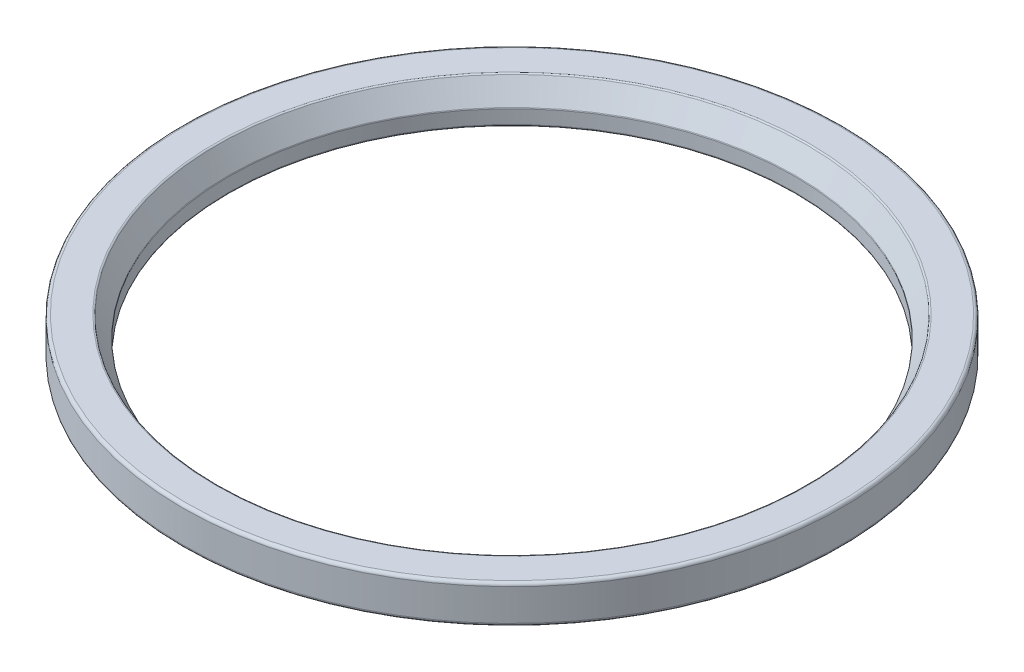
ISO-10303-21;
HEADER;
FILE_DESCRIPTION(('STEP AP214'),'2;1');
FILE_NAME('part.step','',(''),(''),'','','');
FILE_SCHEMA(('AUTOMOTIVE_DESIGN { 1 0 10303 214 1 1 1 1 }'));
ENDSEC;
DATA;
#1=APPLICATION_CONTEXT('core data for automotive mechanical design processes');
#2=APPLICATION_PROTOCOL_DEFINITION('international standard','automotive_design',2000,#1);
#3=PRODUCT_CONTEXT('',#1,'mechanical');
#4=PRODUCT('Part','Part','',(#3));
#5=PRODUCT_RELATED_PRODUCT_CATEGORY('part','',(#4));
#6=PRODUCT_DEFINITION_FORMATION('','',#4);
#7=PRODUCT_DEFINITION_CONTEXT('part definition',#1,'design');
#8=PRODUCT_DEFINITION('design','',#6,#7);
#9=PRODUCT_DEFINITION_SHAPE('','',#8);
#10=(LENGTH_UNIT() NAMED_UNIT(*) SI_UNIT(.MILLI.,.METRE.));
#11=(NAMED_UNIT(*) PLANE_ANGLE_UNIT() SI_UNIT($,.RADIAN.));
#12=(NAMED_UNIT(*) SI_UNIT($,.STERADIAN.) SOLID_ANGLE_UNIT());
#13=UNCERTAINTY_MEASURE_WITH_UNIT(LENGTH_MEASURE(1.E-05),#10,'distance_accuracy_value','');
#14=(GEOMETRIC_REPRESENTATION_CONTEXT(3) GLOBAL_UNCERTAINTY_ASSIGNED_CONTEXT((#13)) GLOBAL_UNIT_ASSIGNED_CONTEXT((#10,
#11,#12)) REPRESENTATION_CONTEXT('',''));
#15=CARTESIAN_POINT('',(0.,0.,0.));
#16=DIRECTION('',(0.,0.,1.));
#17=DIRECTION('',(1.,0.,0.));
#18=AXIS2_PLACEMENT_3D('',#15,#16,#17);
#19=CARTESIAN_POINT('',(0.,20.827256095235,0.));
#20=DIRECTION('',(0.,-1.,0.));
#21=DIRECTION('',(0.,0.,-1.));
#22=AXIS2_PLACEMENT_3D('',#19,#20,#21);
#23=TOROIDAL_SURFACE('',#22,49.25,14.4626191509308);
#24=CARTESIAN_POINT('',(0.,6.80030838335541,0.));
#25=DIRECTION('',(0.,1.,0.));
#26=DIRECTION('',(0.,0.,1.));
#27=AXIS2_PLACEMENT_3D('',#24,#25,#26);
#28=CIRCLE('',#27,45.7269202970884);
#29=CARTESIAN_POINT('',(0.,6.80030838335541,45.7269202970884));
#30=VERTEX_POINT('',#29);
#31=EDGE_CURVE('E46',#30,#30,#28,.T.);
#32=ORIENTED_EDGE('',*,*,#31,.T.);
#33=EDGE_LOOP('',(#32));
#34=FACE_BOUND('',#33,.T.);
#35=CARTESIAN_POINT('',(0.,6.76187932282945,0.));
#36=DIRECTION('',(0.,1.,0.));
#37=DIRECTION('',(0.,0.,1.));
#38=AXIS2_PLACEMENT_3D('',#35,#36,#37);
#39=CIRCLE('',#38,52.6163821760399);
#40=CARTESIAN_POINT('',(0.,6.76187932282945,52.6163821760399));
#41=VERTEX_POINT('',#40);
#42=EDGE_CURVE('E66',#41,#41,#39,.F.);
#43=ORIENTED_EDGE('',*,*,#42,.T.);
#44=EDGE_LOOP('',(#43));
#45=FACE_BOUND('',#44,.T.);
#46=ADVANCED_FACE('F31',(#34,#45),#23,.T.);
#47=CARTESIAN_POINT('',(0.,-41.5419884809563,0.));
#48=DIRECTION('',(0.,-1.,0.));
#49=DIRECTION('',(0.,0.,-1.));
#50=AXIS2_PLACEMENT_3D('',#47,#48,#49);
#51=CYLINDRICAL_SURFACE('',#50,53.);
#52=CARTESIAN_POINT('',(0.,7.2481459051695,0.));
#53=DIRECTION('',(0.,1.,0.));
#54=DIRECTION('',(0.,0.,1.));
#55=AXIS2_PLACEMENT_3D('',#52,#53,#54);
#56=CIRCLE('',#55,53.);
#57=CARTESIAN_POINT('',(0.,7.2481459051695,53.));
#58=VERTEX_POINT('',#57);
#59=EDGE_CURVE('E60',#58,#58,#56,.T.);
#60=ORIENTED_EDGE('',*,*,#59,.T.);
#61=EDGE_LOOP('',(#60));
#62=FACE_BOUND('',#61,.T.);
#63=CARTESIAN_POINT('',(0.,12.3592622269348,0.));
#64=DIRECTION('',(0.,1.,0.));
#65=DIRECTION('',(0.,0.,1.));
#66=AXIS2_PLACEMENT_3D('',#63,#64,#65);
#67=CIRCLE('',#66,53.);
#68=CARTESIAN_POINT('',(0.,12.3592622269348,53.));
#69=VERTEX_POINT('',#68);
#70=EDGE_CURVE('E63',#69,#69,#67,.F.);
#71=ORIENTED_EDGE('',*,*,#70,.T.);
#72=EDGE_LOOP('',(#71));
#73=FACE_BOUND('',#72,.T.);
#74=ADVANCED_FACE('F90',(#62,#73),#51,.T.);
#75=CARTESIAN_POINT('',(47.5,12.8592622269348,0.));
#76=DIRECTION('',(0.,1.,0.));
#77=DIRECTION('',(0.,0.,1.));
#78=AXIS2_PLACEMENT_3D('',#75,#76,#77);
#79=PLANE('',#78);
#80=CARTESIAN_POINT('',(0.,12.8592622269348,0.));
#81=DIRECTION('',(0.,1.,0.));
#82=DIRECTION('',(0.,0.,1.));
#83=AXIS2_PLACEMENT_3D('',#80,#81,#82);
#84=CIRCLE('',#83,47.6740967606414);
#85=CARTESIAN_POINT('',(0.,12.8592622269348,47.6740967606414));
#86=VERTEX_POINT('',#85);
#87=EDGE_CURVE('E10',#86,#86,#84,.F.);
#88=ORIENTED_EDGE('',*,*,#87,.T.);
#89=EDGE_LOOP('',(#88));
#90=FACE_BOUND('',#89,.T.);
#91=CARTESIAN_POINT('',(0.,12.8592622269348,0.));
#92=DIRECTION('',(0.,1.,0.));
#93=DIRECTION('',(0.,0.,1.));
#94=AXIS2_PLACEMENT_3D('',#91,#92,#93);
#95=CIRCLE('',#94,52.5);
#96=CARTESIAN_POINT('',(0.,12.8592622269348,52.5));
#97=VERTEX_POINT('',#96);
#98=EDGE_CURVE('E57',#97,#97,#95,.T.);
#99=ORIENTED_EDGE('',*,*,#98,.T.);
#100=EDGE_LOOP('',(#99));
#101=FACE_BOUND('',#100,.T.);
#102=ADVANCED_FACE('F95',(#90,#101),#79,.T.);
#103=CARTESIAN_POINT('',(0.,12.8592622269348,0.));
#104=DIRECTION('',(0.,1.,0.));
#105=DIRECTION('',(0.,0.,1.));
#106=AXIS2_PLACEMENT_3D('',#103,#104,#105);
#107=CONICAL_SURFACE('',#106,47.5,0.519146114246522);
#108=CARTESIAN_POINT('',(0.,9.42843457731948,0.));
#109=DIRECTION('',(0.,-1.,0.));
#110=DIRECTION('',(0.,0.,-1.));
#111=AXIS2_PLACEMENT_3D('',#108,#109,#110);
#112=CIRCLE('',#111,45.5395270573627);
#113=CARTESIAN_POINT('',(0.,9.42843457731948,-45.5395270573627));
#114=VERTEX_POINT('',#113);
#115=EDGE_CURVE('E38',#114,#114,#112,.T.);
#116=ORIENTED_EDGE('',*,*,#115,.T.);
#117=EDGE_LOOP('',(#116));
#118=FACE_BOUND('',#117,.T.);
#119=CARTESIAN_POINT('',(0.,12.7081039084419,0.));
#120=DIRECTION('',(0.,-1.,0.));
#121=DIRECTION('',(0.,0.,-1.));
#122=AXIS2_PLACEMENT_3D('',#119,#120,#121);
#123=CIRCLE('',#122,47.413623818004);
#124=CARTESIAN_POINT('',(0.,12.7081039084419,-47.413623818004));
#125=VERTEX_POINT('',#124);
#126=EDGE_CURVE('E42',#125,#125,#123,.F.);
#127=ORIENTED_EDGE('',*,*,#126,.T.);
#128=EDGE_LOOP('',(#127));
#129=FACE_BOUND('',#128,.T.);
#130=ADVANCED_FACE('F84',(#118,#129),#107,.F.);
#131=CARTESIAN_POINT('',(0.,-41.5419884809563,0.));
#132=DIRECTION('',(0.,-1.,0.));
#133=DIRECTION('',(0.,0.,-1.));
#134=AXIS2_PLACEMENT_3D('',#131,#132,#133);
#135=CYLINDRICAL_SURFACE('',#134,45.5);
#136=CARTESIAN_POINT('',(0.,7.09127119373219,0.));
#137=DIRECTION('',(0.,1.,0.));
#138=DIRECTION('',(0.,0.,1.));
#139=AXIS2_PLACEMENT_3D('',#136,#137,#138);
#140=CIRCLE('',#139,45.5);
#141=CARTESIAN_POINT('',(0.,7.09127119373219,45.5));
#142=VERTEX_POINT('',#141);
#143=EDGE_CURVE('E51',#142,#142,#140,.F.);
#144=ORIENTED_EDGE('',*,*,#143,.T.);
#145=EDGE_LOOP('',(#144));
#146=FACE_BOUND('',#145,.T.);
#147=CARTESIAN_POINT('',(0.,9.27959289581241,0.));
#148=DIRECTION('',(0.,1.,0.));
#149=DIRECTION('',(0.,0.,1.));
#150=AXIS2_PLACEMENT_3D('',#147,#148,#149);
#151=CIRCLE('',#150,45.5);
#152=CARTESIAN_POINT('',(0.,9.27959289581241,45.5));
#153=VERTEX_POINT('',#152);
#154=EDGE_CURVE('E54',#153,#153,#151,.T.);
#155=ORIENTED_EDGE('',*,*,#154,.T.);
#156=EDGE_LOOP('',(#155));
#157=FACE_BOUND('',#156,.T.);
#158=ADVANCED_FACE('F74',(#146,#157),#135,.F.);
#159=CARTESIAN_POINT('',(0.,7.2481459051695,0.));
#160=DIRECTION('',(0.,1.,0.));
#161=DIRECTION('',(0.,0.,1.));
#162=AXIS2_PLACEMENT_3D('',#159,#160,#161);
#163=TOROIDAL_SURFACE('',#162,52.5,0.5);
#164=ORIENTED_EDGE('',*,*,#59,.F.);
#165=EDGE_LOOP('',(#164));
#166=FACE_BOUND('',#165,.T.);
#167=ORIENTED_EDGE('',*,*,#42,.F.);
#168=EDGE_LOOP('',(#167));
#169=FACE_BOUND('',#168,.T.);
#170=ADVANCED_FACE('F71',(#166,#169),#163,.T.);
#171=CARTESIAN_POINT('',(0.,12.3592622269348,0.));
#172=DIRECTION('',(0.,1.,0.));
#173=DIRECTION('',(0.,0.,1.));
#174=AXIS2_PLACEMENT_3D('',#171,#172,#173);
#175=TOROIDAL_SURFACE('',#174,52.5,0.5);
#176=ORIENTED_EDGE('',*,*,#98,.F.);
#177=EDGE_LOOP('',(#176));
#178=FACE_BOUND('',#177,.T.);
#179=ORIENTED_EDGE('',*,*,#70,.F.);
#180=EDGE_LOOP('',(#179));
#181=FACE_BOUND('',#180,.T.);
#182=ADVANCED_FACE('F73',(#178,#181),#175,.T.);
#183=CARTESIAN_POINT('',(0.,7.09127119373219,0.));
#184=DIRECTION('',(0.,1.,0.));
#185=DIRECTION('',(0.,0.,1.));
#186=AXIS2_PLACEMENT_3D('',#183,#184,#185);
#187=TOROIDAL_SURFACE('',#186,45.8,0.3);
#188=ORIENTED_EDGE('',*,*,#31,.F.);
#189=EDGE_LOOP('',(#188));
#190=FACE_BOUND('',#189,.T.);
#191=ORIENTED_EDGE('',*,*,#143,.F.);
#192=EDGE_LOOP('',(#191));
#193=FACE_BOUND('',#192,.T.);
#194=ADVANCED_FACE('F81',(#190,#193),#187,.T.);
#195=CARTESIAN_POINT('',(0.,9.27959289581241,0.));
#196=DIRECTION('',(0.,1.,0.));
#197=DIRECTION('',(0.,0.,1.));
#198=AXIS2_PLACEMENT_3D('',#195,#196,#197);
#199=TOROIDAL_SURFACE('',#198,45.8,0.3);
#200=ORIENTED_EDGE('',*,*,#154,.F.);
#201=EDGE_LOOP('',(#200));
#202=FACE_BOUND('',#201,.T.);
#203=ORIENTED_EDGE('',*,*,#115,.F.);
#204=EDGE_LOOP('',(#203));
#205=FACE_BOUND('',#204,.T.);
#206=ADVANCED_FACE('F109',(#202,#205),#199,.T.);
#207=CARTESIAN_POINT('',(0.,12.5592622269348,0.));
#208=DIRECTION('',(0.,1.,0.));
#209=DIRECTION('',(0.,0.,1.));
#210=AXIS2_PLACEMENT_3D('',#207,#208,#209);
#211=TOROIDAL_SURFACE('',#210,47.6740967606414,0.3);
#212=ORIENTED_EDGE('',*,*,#126,.F.);
#213=EDGE_LOOP('',(#212));
#214=FACE_BOUND('',#213,.T.);
#215=ORIENTED_EDGE('',*,*,#87,.F.);
#216=EDGE_LOOP('',(#215));
#217=FACE_BOUND('',#216,.T.);
#218=ADVANCED_FACE('F33',(#214,#217),#211,.T.);
#219=CLOSED_SHELL('',(#46,#74,#102,#130,#158,#170,#182,#194,#206,#218));
#220=MANIFOLD_SOLID_BREP('B2',#219);
#221=ADVANCED_BREP_SHAPE_REPRESENTATION('',(#18,#220),#14);
#222=SHAPE_DEFINITION_REPRESENTATION(#9,#221);
ENDSEC;
END-ISO-10303-21;
